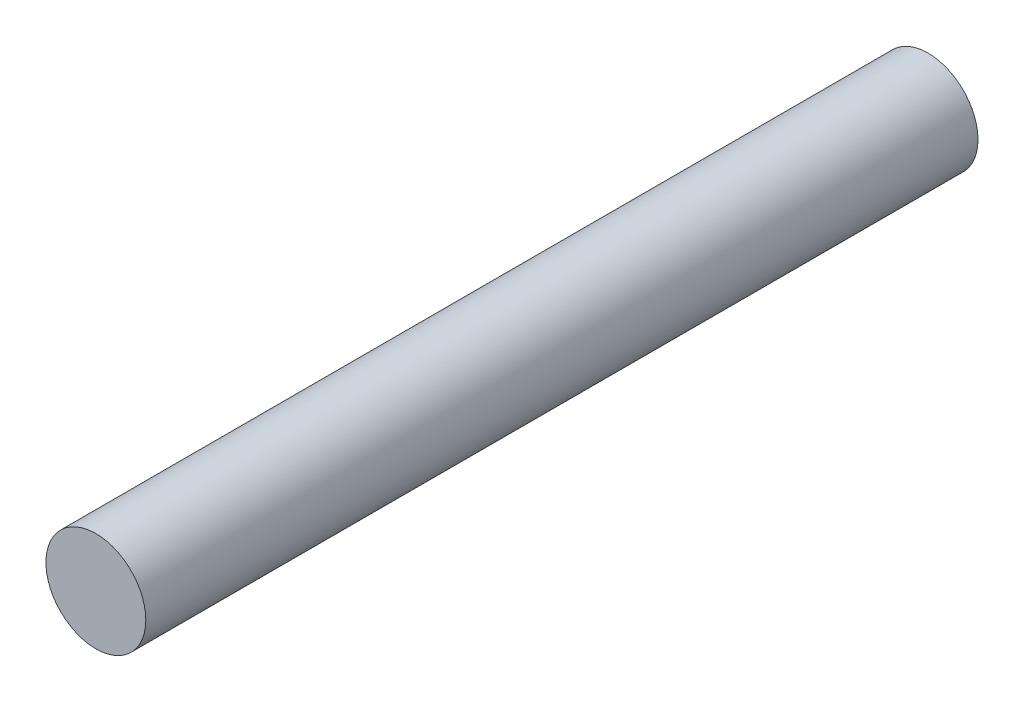
ISO-10303-21;
HEADER;
FILE_DESCRIPTION(('STEP AP214'),'2;1');
FILE_NAME('part.step','',(''),(''),'','','');
FILE_SCHEMA(('AUTOMOTIVE_DESIGN { 1 0 10303 214 1 1 1 1 }'));
ENDSEC;
DATA;
#1=APPLICATION_CONTEXT('core data for automotive mechanical design processes');
#2=APPLICATION_PROTOCOL_DEFINITION('international standard','automotive_design',2000,#1);
#3=PRODUCT_CONTEXT('',#1,'mechanical');
#4=PRODUCT('Part','Part','',(#3));
#5=PRODUCT_RELATED_PRODUCT_CATEGORY('part','',(#4));
#6=PRODUCT_DEFINITION_FORMATION('','',#4);
#7=PRODUCT_DEFINITION_CONTEXT('part definition',#1,'design');
#8=PRODUCT_DEFINITION('design','',#6,#7);
#9=PRODUCT_DEFINITION_SHAPE('','',#8);
#10=(LENGTH_UNIT() NAMED_UNIT(*) SI_UNIT(.MILLI.,.METRE.));
#11=(NAMED_UNIT(*) PLANE_ANGLE_UNIT() SI_UNIT($,.RADIAN.));
#12=(NAMED_UNIT(*) SI_UNIT($,.STERADIAN.) SOLID_ANGLE_UNIT());
#13=UNCERTAINTY_MEASURE_WITH_UNIT(LENGTH_MEASURE(1.E-05),#10,'distance_accuracy_value','');
#14=(GEOMETRIC_REPRESENTATION_CONTEXT(3) GLOBAL_UNCERTAINTY_ASSIGNED_CONTEXT((#13)) GLOBAL_UNIT_ASSIGNED_CONTEXT((#10,
#11,#12)) REPRESENTATION_CONTEXT('',''));
#15=CARTESIAN_POINT('',(0.,0.,0.));
#16=DIRECTION('',(0.,0.,1.));
#17=DIRECTION('',(1.,0.,0.));
#18=AXIS2_PLACEMENT_3D('',#15,#16,#17);
#19=CARTESIAN_POINT('',(0.,0.,-25.));
#20=DIRECTION('',(0.,0.,1.));
#21=DIRECTION('',(1.,0.,0.));
#22=AXIS2_PLACEMENT_3D('',#19,#20,#21);
#23=CYLINDRICAL_SURFACE('',#22,1.5);
#24=CARTESIAN_POINT('',(0.,0.,-25.));
#25=DIRECTION('',(0.,0.,1.));
#26=DIRECTION('',(1.,0.,0.));
#27=AXIS2_PLACEMENT_3D('',#24,#25,#26);
#28=CIRCLE('',#27,1.5);
#29=CARTESIAN_POINT('',(1.5,0.,-25.));
#30=VERTEX_POINT('',#29);
#31=EDGE_CURVE('E10',#30,#30,#28,.T.);
#32=ORIENTED_EDGE('',*,*,#31,.T.);
#33=EDGE_LOOP('',(#32));
#34=FACE_BOUND('',#33,.T.);
#35=CARTESIAN_POINT('',(0.,0.,0.));
#36=DIRECTION('',(0.,0.,1.));
#37=DIRECTION('',(1.,0.,0.));
#38=AXIS2_PLACEMENT_3D('',#35,#36,#37);
#39=CIRCLE('',#38,1.5);
#40=CARTESIAN_POINT('',(1.5,0.,0.));
#41=VERTEX_POINT('',#40);
#42=EDGE_CURVE('E38',#41,#41,#39,.T.);
#43=ORIENTED_EDGE('',*,*,#42,.F.);
#44=EDGE_LOOP('',(#43));
#45=FACE_BOUND('',#44,.T.);
#46=ADVANCED_FACE('F35',(#34,#45),#23,.T.);
#47=CARTESIAN_POINT('',(0.,0.,-25.));
#48=DIRECTION('',(0.,0.,1.));
#49=DIRECTION('',(1.,0.,0.));
#50=AXIS2_PLACEMENT_3D('',#47,#48,#49);
#51=PLANE('',#50);
#52=ORIENTED_EDGE('',*,*,#31,.F.);
#53=EDGE_LOOP('',(#52));
#54=FACE_BOUND('',#53,.T.);
#55=ADVANCED_FACE('F50',(#54),#51,.F.);
#56=CARTESIAN_POINT('',(0.,0.,0.));
#57=DIRECTION('',(0.,0.,1.));
#58=DIRECTION('',(1.,0.,0.));
#59=AXIS2_PLACEMENT_3D('',#56,#57,#58);
#60=PLANE('',#59);
#61=ORIENTED_EDGE('',*,*,#42,.T.);
#62=EDGE_LOOP('',(#61));
#63=FACE_BOUND('',#62,.T.);
#64=ADVANCED_FACE('F47',(#63),#60,.T.);
#65=CLOSED_SHELL('',(#46,#55,#64));
#66=MANIFOLD_SOLID_BREP('B2',#65);
#67=ADVANCED_BREP_SHAPE_REPRESENTATION('',(#18,#66),#14);
#68=SHAPE_DEFINITION_REPRESENTATION(#9,#67);
ENDSEC;
END-ISO-10303-21;
